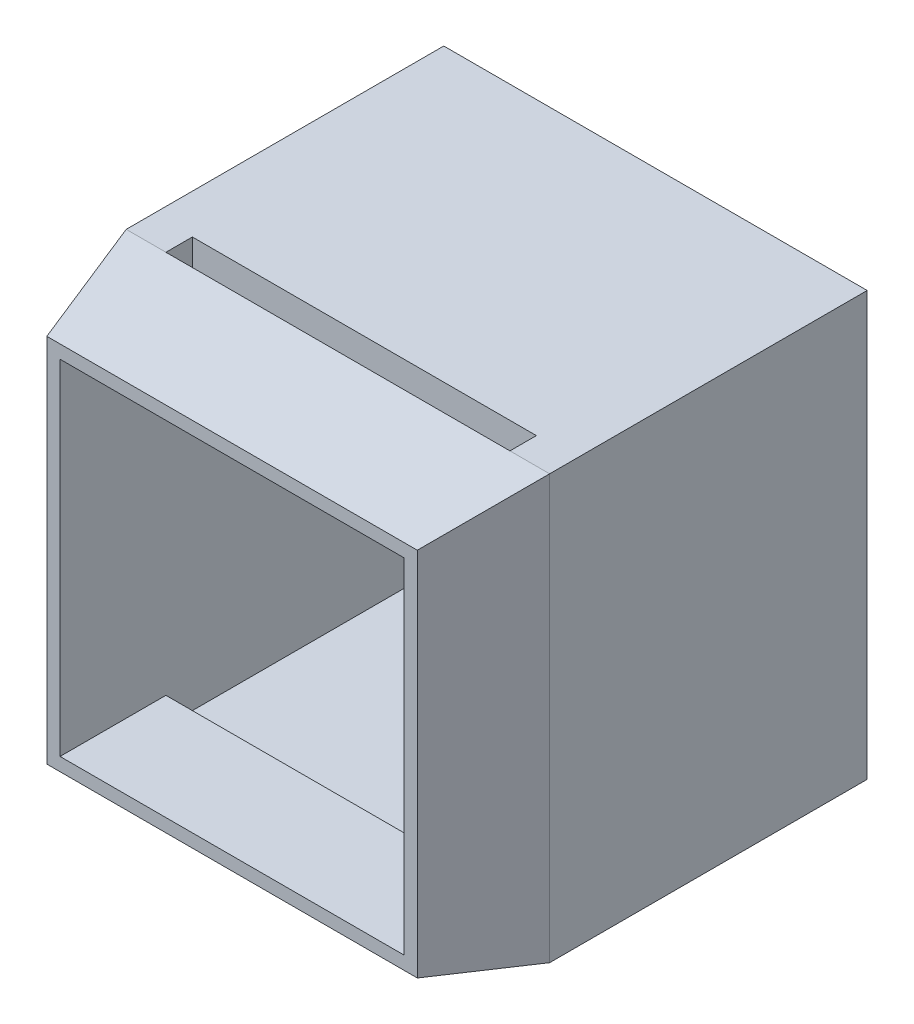
ISO-10303-21;
HEADER;
FILE_DESCRIPTION(('STEP AP214'),'2;1');
FILE_NAME('part.step','',(''),(''),'','','');
FILE_SCHEMA(('AUTOMOTIVE_DESIGN { 1 0 10303 214 1 1 1 1 }'));
ENDSEC;
DATA;
#1=APPLICATION_CONTEXT('core data for automotive mechanical design processes');
#2=APPLICATION_PROTOCOL_DEFINITION('international standard','automotive_design',2000,#1);
#3=PRODUCT_CONTEXT('',#1,'mechanical');
#4=PRODUCT('Part','Part','',(#3));
#5=PRODUCT_RELATED_PRODUCT_CATEGORY('part','',(#4));
#6=PRODUCT_DEFINITION_FORMATION('','',#4);
#7=PRODUCT_DEFINITION_CONTEXT('part definition',#1,'design');
#8=PRODUCT_DEFINITION('design','',#6,#7);
#9=PRODUCT_DEFINITION_SHAPE('','',#8);
#10=(LENGTH_UNIT() NAMED_UNIT(*) SI_UNIT(.MILLI.,.METRE.));
#11=(NAMED_UNIT(*) PLANE_ANGLE_UNIT() SI_UNIT($,.RADIAN.));
#12=(NAMED_UNIT(*) SI_UNIT($,.STERADIAN.) SOLID_ANGLE_UNIT());
#13=UNCERTAINTY_MEASURE_WITH_UNIT(LENGTH_MEASURE(1.E-05),#10,'distance_accuracy_value','');
#14=(GEOMETRIC_REPRESENTATION_CONTEXT(3) GLOBAL_UNCERTAINTY_ASSIGNED_CONTEXT((#13)) GLOBAL_UNIT_ASSIGNED_CONTEXT((#10,
#11,#12)) REPRESENTATION_CONTEXT('',''));
#15=CARTESIAN_POINT('',(0.,0.,0.));
#16=DIRECTION('',(0.,0.,1.));
#17=DIRECTION('',(1.,0.,0.));
#18=AXIS2_PLACEMENT_3D('',#15,#16,#17);
#19=CARTESIAN_POINT('',(38.1,-2.50000000145967E-05,279.4));
#20=DIRECTION('',(0.,0.,-1.));
#21=DIRECTION('',(-1.,0.,0.));
#22=AXIS2_PLACEMENT_3D('',#19,#20,#21);
#23=PLANE('',#22);
#24=DIRECTION('',(1.,0.,0.));
#25=VECTOR('',#24,1.);
#26=CARTESIAN_POINT('',(38.1,12.7,279.4));
#27=LINE('',#26,#25);
#28=CARTESIAN_POINT('',(38.1,12.7,279.4));
#29=VERTEX_POINT('',#28);
#30=CARTESIAN_POINT('',(368.3,12.7,279.4));
#31=VERTEX_POINT('',#30);
#32=EDGE_CURVE('E203',#29,#31,#27,.T.);
#33=ORIENTED_EDGE('',*,*,#32,.F.);
#34=DIRECTION('',(0.,1.,0.));
#35=VECTOR('',#34,1.);
#36=CARTESIAN_POINT('',(38.1,-2.50000000145967E-05,279.4));
#37=LINE('',#36,#35);
#38=CARTESIAN_POINT('',(38.1,0.,279.4));
#39=VERTEX_POINT('',#38);
#40=EDGE_CURVE('E201',#39,#29,#37,.T.);
#41=ORIENTED_EDGE('',*,*,#40,.F.);
#42=DIRECTION('',(-1.,0.,0.));
#43=VECTOR('',#42,1.);
#44=CARTESIAN_POINT('',(0.,0.,279.4));
#45=LINE('',#44,#43);
#46=CARTESIAN_POINT('',(368.3,0.,279.4));
#47=VERTEX_POINT('',#46);
#48=EDGE_CURVE('E261',#47,#39,#45,.T.);
#49=ORIENTED_EDGE('',*,*,#48,.F.);
#50=DIRECTION('',(0.,1.,0.));
#51=VECTOR('',#50,1.);
#52=CARTESIAN_POINT('',(368.3,-2.50000000145967E-05,279.4));
#53=LINE('',#52,#51);
#54=EDGE_CURVE('E220',#47,#31,#53,.T.);
#55=ORIENTED_EDGE('',*,*,#54,.T.);
#56=EDGE_LOOP('',(#33,#41,#49,#55));
#57=FACE_BOUND('',#56,.T.);
#58=ADVANCED_FACE('F56',(#57),#23,.F.);
#59=CARTESIAN_POINT('',(38.1,368.3,0.));
#60=DIRECTION('',(0.,1.,0.));
#61=DIRECTION('',(0.,0.,1.));
#62=AXIS2_PLACEMENT_3D('',#59,#60,#61);
#63=PLANE('',#62);
#64=DIRECTION('',(0.,0.,1.));
#65=VECTOR('',#64,1.);
#66=CARTESIAN_POINT('',(368.3,368.3,0.));
#67=LINE('',#66,#65);
#68=CARTESIAN_POINT('',(368.3,368.3,0.));
#69=VERTEX_POINT('',#68);
#70=CARTESIAN_POINT('',(368.3,368.3,279.4));
#71=VERTEX_POINT('',#70);
#72=EDGE_CURVE('E282',#69,#71,#67,.T.);
#73=ORIENTED_EDGE('',*,*,#72,.T.);
#74=DIRECTION('',(-1.,0.,0.));
#75=VECTOR('',#74,1.);
#76=CARTESIAN_POINT('',(38.1,368.3,279.4));
#77=LINE('',#76,#75);
#78=CARTESIAN_POINT('',(38.1,368.3,279.4));
#79=VERTEX_POINT('',#78);
#80=EDGE_CURVE('E253',#71,#79,#77,.T.);
#81=ORIENTED_EDGE('',*,*,#80,.T.);
#82=DIRECTION('',(0.,0.,1.));
#83=VECTOR('',#82,1.);
#84=CARTESIAN_POINT('',(38.1,368.3,0.));
#85=LINE('',#84,#83);
#86=CARTESIAN_POINT('',(38.1,368.3,0.));
#87=VERTEX_POINT('',#86);
#88=EDGE_CURVE('E277',#87,#79,#85,.T.);
#89=ORIENTED_EDGE('',*,*,#88,.F.);
#90=DIRECTION('',(-1.,0.,0.));
#91=VECTOR('',#90,1.);
#92=CARTESIAN_POINT('',(38.1,368.3,0.));
#93=LINE('',#92,#91);
#94=EDGE_CURVE('E190',#69,#87,#93,.T.);
#95=ORIENTED_EDGE('',*,*,#94,.F.);
#96=EDGE_LOOP('',(#73,#81,#89,#95));
#97=FACE_BOUND('',#96,.T.);
#98=ADVANCED_FACE('F358',(#97),#63,.F.);
#99=CARTESIAN_POINT('',(0.,0.,304.8));
#100=DIRECTION('',(1.,0.,0.));
#101=DIRECTION('',(0.,0.,-1.));
#102=AXIS2_PLACEMENT_3D('',#99,#100,#101);
#103=PLANE('',#102);
#104=DIRECTION('',(0.,-1.,0.));
#105=VECTOR('',#104,1.);
#106=CARTESIAN_POINT('',(0.,0.,0.));
#107=LINE('',#106,#105);
#108=CARTESIAN_POINT('',(0.,406.4,0.));
#109=VERTEX_POINT('',#108);
#110=CARTESIAN_POINT('',(0.,0.,0.));
#111=VERTEX_POINT('',#110);
#112=EDGE_CURVE('E314',#109,#111,#107,.T.);
#113=ORIENTED_EDGE('',*,*,#112,.T.);
#114=DIRECTION('',(0.,0.,-1.));
#115=VECTOR('',#114,1.);
#116=CARTESIAN_POINT('',(0.,0.,304.8));
#117=LINE('',#116,#115);
#118=CARTESIAN_POINT('',(0.,0.,304.8));
#119=VERTEX_POINT('',#118);
#120=EDGE_CURVE('E419',#119,#111,#117,.T.);
#121=ORIENTED_EDGE('',*,*,#120,.F.);
#122=DIRECTION('',(0.,1.,0.));
#123=VECTOR('',#122,1.);
#124=CARTESIAN_POINT('',(0.,0.,304.8));
#125=LINE('',#124,#123);
#126=CARTESIAN_POINT('',(0.,406.4,304.8));
#127=VERTEX_POINT('',#126);
#128=EDGE_CURVE('E428',#127,#119,#125,.F.);
#129=ORIENTED_EDGE('',*,*,#128,.F.);
#130=DIRECTION('',(0.,0.,-1.));
#131=VECTOR('',#130,1.);
#132=CARTESIAN_POINT('',(0.,406.4,304.8));
#133=LINE('',#132,#131);
#134=EDGE_CURVE('E439',#127,#109,#133,.T.);
#135=ORIENTED_EDGE('',*,*,#134,.T.);
#136=EDGE_LOOP('',(#113,#121,#129,#135));
#137=FACE_BOUND('',#136,.T.);
#138=ADVANCED_FACE('F58',(#137),#103,.F.);
#139=CARTESIAN_POINT('',(0.,0.,304.8));
#140=DIRECTION('',(0.,1.,0.));
#141=DIRECTION('',(0.,0.,1.));
#142=AXIS2_PLACEMENT_3D('',#139,#140,#141);
#143=PLANE('',#142);
#144=ORIENTED_EDGE('',*,*,#48,.T.);
#145=DIRECTION('',(0.,0.,1.));
#146=VECTOR('',#145,1.);
#147=CARTESIAN_POINT('',(38.1,0.,304.8));
#148=LINE('',#147,#146);
#149=CARTESIAN_POINT('',(38.1,0.,304.8));
#150=VERTEX_POINT('',#149);
#151=EDGE_CURVE('E195',#39,#150,#148,.T.);
#152=ORIENTED_EDGE('',*,*,#151,.T.);
#153=DIRECTION('',(1.,0.,0.));
#154=VECTOR('',#153,1.);
#155=CARTESIAN_POINT('',(0.,0.,304.8));
#156=LINE('',#155,#154);
#157=EDGE_CURVE('E444',#119,#150,#156,.T.);
#158=ORIENTED_EDGE('',*,*,#157,.F.);
#159=ORIENTED_EDGE('',*,*,#120,.T.);
#160=DIRECTION('',(1.,0.,0.));
#161=VECTOR('',#160,1.);
#162=CARTESIAN_POINT('',(0.,0.,0.));
#163=LINE('',#162,#161);
#164=CARTESIAN_POINT('',(406.4,0.,0.));
#165=VERTEX_POINT('',#164);
#166=EDGE_CURVE('E463',#111,#165,#163,.T.);
#167=ORIENTED_EDGE('',*,*,#166,.T.);
#168=DIRECTION('',(0.,0.,-1.));
#169=VECTOR('',#168,1.);
#170=CARTESIAN_POINT('',(406.4,0.,304.8));
#171=LINE('',#170,#169);
#172=CARTESIAN_POINT('',(406.4,0.,304.8));
#173=VERTEX_POINT('',#172);
#174=EDGE_CURVE('E425',#173,#165,#171,.T.);
#175=ORIENTED_EDGE('',*,*,#174,.F.);
#176=CARTESIAN_POINT('',(368.3,0.,304.8));
#177=VERTEX_POINT('',#176);
#178=EDGE_CURVE('E434',#177,#173,#156,.T.);
#179=ORIENTED_EDGE('',*,*,#178,.F.);
#180=DIRECTION('',(0.,0.,-1.));
#181=VECTOR('',#180,1.);
#182=CARTESIAN_POINT('',(368.3,0.,304.8));
#183=LINE('',#182,#181);
#184=EDGE_CURVE('E249',#177,#47,#183,.T.);
#185=ORIENTED_EDGE('',*,*,#184,.T.);
#186=EDGE_LOOP('',(#144,#152,#158,#159,#167,#175,#179,#185));
#187=FACE_BOUND('',#186,.T.);
#188=ADVANCED_FACE('F350',(#187),#143,.F.);
#189=CARTESIAN_POINT('',(406.4,0.,304.8));
#190=DIRECTION('',(-1.,0.,0.));
#191=DIRECTION('',(0.,0.,1.));
#192=AXIS2_PLACEMENT_3D('',#189,#190,#191);
#193=PLANE('',#192);
#194=DIRECTION('',(0.,1.,0.));
#195=VECTOR('',#194,1.);
#196=CARTESIAN_POINT('',(406.4,0.,0.));
#197=LINE('',#196,#195);
#198=CARTESIAN_POINT('',(406.4,406.4,0.));
#199=VERTEX_POINT('',#198);
#200=EDGE_CURVE('E460',#165,#199,#197,.T.);
#201=ORIENTED_EDGE('',*,*,#200,.T.);
#202=DIRECTION('',(0.,0.,-1.));
#203=VECTOR('',#202,1.);
#204=CARTESIAN_POINT('',(406.4,406.4,304.8));
#205=LINE('',#204,#203);
#206=CARTESIAN_POINT('',(406.4,406.4,304.8));
#207=VERTEX_POINT('',#206);
#208=EDGE_CURVE('E451',#207,#199,#205,.T.);
#209=ORIENTED_EDGE('',*,*,#208,.F.);
#210=DIRECTION('',(0.,1.,0.));
#211=VECTOR('',#210,1.);
#212=CARTESIAN_POINT('',(406.4,0.,304.8));
#213=LINE('',#212,#211);
#214=EDGE_CURVE('E440',#173,#207,#213,.T.);
#215=ORIENTED_EDGE('',*,*,#214,.F.);
#216=ORIENTED_EDGE('',*,*,#174,.T.);
#217=EDGE_LOOP('',(#201,#209,#215,#216));
#218=FACE_BOUND('',#217,.T.);
#219=ADVANCED_FACE('F347',(#218),#193,.F.);
#220=CARTESIAN_POINT('',(0.,406.4,304.8));
#221=DIRECTION('',(0.,-1.,0.));
#222=DIRECTION('',(0.,0.,-1.));
#223=AXIS2_PLACEMENT_3D('',#220,#221,#222);
#224=PLANE('',#223);
#225=DIRECTION('',(1.,0.,0.));
#226=VECTOR('',#225,1.);
#227=CARTESIAN_POINT('',(0.,406.4,304.8));
#228=LINE('',#227,#226);
#229=CARTESIAN_POINT('',(38.1,406.4,304.8));
#230=VERTEX_POINT('',#229);
#231=EDGE_CURVE('E389',#230,#127,#228,.F.);
#232=ORIENTED_EDGE('',*,*,#231,.F.);
#233=DIRECTION('',(0.,0.,-1.));
#234=VECTOR('',#233,1.);
#235=CARTESIAN_POINT('',(38.1,406.4,304.8));
#236=LINE('',#235,#234);
#237=CARTESIAN_POINT('',(38.1,406.4,279.4));
#238=VERTEX_POINT('',#237);
#239=EDGE_CURVE('E265',#230,#238,#236,.T.);
#240=ORIENTED_EDGE('',*,*,#239,.T.);
#241=DIRECTION('',(1.,0.,0.));
#242=VECTOR('',#241,1.);
#243=CARTESIAN_POINT('',(0.,406.4,279.4));
#244=LINE('',#243,#242);
#245=CARTESIAN_POINT('',(368.3,406.4,279.4));
#246=VERTEX_POINT('',#245);
#247=EDGE_CURVE('E257',#238,#246,#244,.T.);
#248=ORIENTED_EDGE('',*,*,#247,.T.);
#249=DIRECTION('',(0.,0.,1.));
#250=VECTOR('',#249,1.);
#251=CARTESIAN_POINT('',(368.3,406.4,304.8));
#252=LINE('',#251,#250);
#253=CARTESIAN_POINT('',(368.3,406.4,304.8));
#254=VERTEX_POINT('',#253);
#255=EDGE_CURVE('E245',#246,#254,#252,.T.);
#256=ORIENTED_EDGE('',*,*,#255,.T.);
#257=EDGE_CURVE('E436',#207,#254,#228,.F.);
#258=ORIENTED_EDGE('',*,*,#257,.F.);
#259=ORIENTED_EDGE('',*,*,#208,.T.);
#260=DIRECTION('',(-1.,0.,0.));
#261=VECTOR('',#260,1.);
#262=CARTESIAN_POINT('',(0.,406.4,0.));
#263=LINE('',#262,#261);
#264=EDGE_CURVE('E435',#199,#109,#263,.T.);
#265=ORIENTED_EDGE('',*,*,#264,.T.);
#266=ORIENTED_EDGE('',*,*,#134,.F.);
#267=EDGE_LOOP('',(#232,#240,#248,#256,#258,#259,#265,#266));
#268=FACE_BOUND('',#267,.T.);
#269=ADVANCED_FACE('F344',(#268),#224,.F.);
#270=CARTESIAN_POINT('',(0.,0.,0.));
#271=DIRECTION('',(0.,0.,-1.));
#272=DIRECTION('',(-1.,0.,0.));
#273=AXIS2_PLACEMENT_3D('',#270,#271,#272);
#274=PLANE('',#273);
#275=DIRECTION('',(-1.,0.,0.));
#276=VECTOR('',#275,1.);
#277=CARTESIAN_POINT('',(368.3,12.7,0.));
#278=LINE('',#277,#276);
#279=CARTESIAN_POINT('',(368.3,12.7,0.));
#280=VERTEX_POINT('',#279);
#281=CARTESIAN_POINT('',(38.1,12.7,0.));
#282=VERTEX_POINT('',#281);
#283=EDGE_CURVE('E188',#280,#282,#278,.T.);
#284=ORIENTED_EDGE('',*,*,#283,.F.);
#285=DIRECTION('',(0.,1.,0.));
#286=VECTOR('',#285,1.);
#287=CARTESIAN_POINT('',(368.3,38.1,0.));
#288=LINE('',#287,#286);
#289=EDGE_CURVE('E194',#280,#69,#288,.T.);
#290=ORIENTED_EDGE('',*,*,#289,.T.);
#291=ORIENTED_EDGE('',*,*,#94,.T.);
#292=DIRECTION('',(0.,-1.,0.));
#293=VECTOR('',#292,1.);
#294=CARTESIAN_POINT('',(38.1,38.1,0.));
#295=LINE('',#294,#293);
#296=EDGE_CURVE('E184',#87,#282,#295,.T.);
#297=ORIENTED_EDGE('',*,*,#296,.T.);
#298=EDGE_LOOP('',(#284,#290,#291,#297));
#299=FACE_BOUND('',#298,.T.);
#300=ORIENTED_EDGE('',*,*,#112,.F.);
#301=ORIENTED_EDGE('',*,*,#264,.F.);
#302=ORIENTED_EDGE('',*,*,#200,.F.);
#303=ORIENTED_EDGE('',*,*,#166,.F.);
#304=EDGE_LOOP('',(#300,#301,#302,#303));
#305=FACE_BOUND('',#304,.T.);
#306=ADVANCED_FACE('F185',(#299,#305),#274,.T.);
#307=CARTESIAN_POINT('',(0.,0.,406.4));
#308=DIRECTION('',(0.,0.,-1.));
#309=DIRECTION('',(-1.,0.,0.));
#310=AXIS2_PLACEMENT_3D('',#307,#308,#309);
#311=PLANE('',#310);
#312=DIRECTION('',(-1.,0.,0.));
#313=VECTOR('',#312,1.);
#314=CARTESIAN_POINT('',(0.,38.1,406.4));
#315=LINE('',#314,#313);
#316=CARTESIAN_POINT('',(368.3,38.1,406.4));
#317=VERTEX_POINT('',#316);
#318=CARTESIAN_POINT('',(38.1,38.1,406.4));
#319=VERTEX_POINT('',#318);
#320=EDGE_CURVE('E414',#317,#319,#315,.T.);
#321=ORIENTED_EDGE('',*,*,#320,.T.);
#322=DIRECTION('',(0.,1.,0.));
#323=VECTOR('',#322,1.);
#324=CARTESIAN_POINT('',(38.1,0.,406.4));
#325=LINE('',#324,#323);
#326=CARTESIAN_POINT('',(38.1,368.3,406.4));
#327=VERTEX_POINT('',#326);
#328=EDGE_CURVE('E65',#319,#327,#325,.T.);
#329=ORIENTED_EDGE('',*,*,#328,.T.);
#330=DIRECTION('',(1.,0.,0.));
#331=VECTOR('',#330,1.);
#332=CARTESIAN_POINT('',(0.,368.3,406.4));
#333=LINE('',#332,#331);
#334=CARTESIAN_POINT('',(368.3,368.3,406.4));
#335=VERTEX_POINT('',#334);
#336=EDGE_CURVE('E395',#327,#335,#333,.T.);
#337=ORIENTED_EDGE('',*,*,#336,.T.);
#338=DIRECTION('',(0.,-1.,0.));
#339=VECTOR('',#338,1.);
#340=CARTESIAN_POINT('',(368.3,0.,406.4));
#341=LINE('',#340,#339);
#342=EDGE_CURVE('E417',#335,#317,#341,.T.);
#343=ORIENTED_EDGE('',*,*,#342,.T.);
#344=EDGE_LOOP('',(#321,#329,#337,#343));
#345=FACE_BOUND('',#344,.T.);
#346=DIRECTION('',(0.,-1.,0.));
#347=VECTOR('',#346,1.);
#348=CARTESIAN_POINT('',(25.4,25.4,406.4));
#349=LINE('',#348,#347);
#350=CARTESIAN_POINT('',(25.4,381.,406.4));
#351=VERTEX_POINT('',#350);
#352=CARTESIAN_POINT('',(25.4,25.4,406.4));
#353=VERTEX_POINT('',#352);
#354=EDGE_CURVE('E280',#351,#353,#349,.T.);
#355=ORIENTED_EDGE('',*,*,#354,.T.);
#356=DIRECTION('',(1.,0.,0.));
#357=VECTOR('',#356,1.);
#358=CARTESIAN_POINT('',(25.4,25.4,406.4));
#359=LINE('',#358,#357);
#360=CARTESIAN_POINT('',(381.,25.4,406.4));
#361=VERTEX_POINT('',#360);
#362=EDGE_CURVE('E303',#353,#361,#359,.T.);
#363=ORIENTED_EDGE('',*,*,#362,.T.);
#364=DIRECTION('',(0.,1.,0.));
#365=VECTOR('',#364,1.);
#366=CARTESIAN_POINT('',(381.,25.4,406.4));
#367=LINE('',#366,#365);
#368=CARTESIAN_POINT('',(381.,381.,406.4));
#369=VERTEX_POINT('',#368);
#370=EDGE_CURVE('E511',#361,#369,#367,.T.);
#371=ORIENTED_EDGE('',*,*,#370,.T.);
#372=DIRECTION('',(-1.,0.,0.));
#373=VECTOR('',#372,1.);
#374=CARTESIAN_POINT('',(25.4,381.,406.4));
#375=LINE('',#374,#373);
#376=EDGE_CURVE('E504',#369,#351,#375,.T.);
#377=ORIENTED_EDGE('',*,*,#376,.T.);
#378=EDGE_LOOP('',(#355,#363,#371,#377));
#379=FACE_BOUND('',#378,.T.);
#380=ADVANCED_FACE('F343',(#345,#379),#311,.F.);
#381=CARTESIAN_POINT('',(0.,454.211764705882,113.552941176471));
#382=DIRECTION('',(0.,-0.970142500145332,-0.242535625036333));
#383=DIRECTION('',(0.,0.242535625036333,-0.970142500145332));
#384=AXIS2_PLACEMENT_3D('',#381,#382,#383);
#385=PLANE('',#384);
#386=DIRECTION('',(0.235702260395516,-0.235702260395516,0.942809041582063));
#387=VECTOR('',#386,1.);
#388=CARTESIAN_POINT('',(0.,406.4,304.8));
#389=LINE('',#388,#387);
#390=EDGE_CURVE('E297',#127,#351,#389,.T.);
#391=ORIENTED_EDGE('',*,*,#390,.T.);
#392=ORIENTED_EDGE('',*,*,#376,.F.);
#393=DIRECTION('',(-0.235702260395516,-0.235702260395516,0.942809041582063));
#394=VECTOR('',#393,1.);
#395=CARTESIAN_POINT('',(406.4,406.4,304.8));
#396=LINE('',#395,#394);
#397=EDGE_CURVE('E292',#207,#369,#396,.T.);
#398=ORIENTED_EDGE('',*,*,#397,.F.);
#399=ORIENTED_EDGE('',*,*,#257,.T.);
#400=DIRECTION('',(-1.,0.,0.));
#401=VECTOR('',#400,1.);
#402=CARTESIAN_POINT('',(0.,406.4,304.8));
#403=LINE('',#402,#401);
#404=EDGE_CURVE('E241',#254,#230,#403,.T.);
#405=ORIENTED_EDGE('',*,*,#404,.T.);
#406=ORIENTED_EDGE('',*,*,#231,.T.);
#407=EDGE_LOOP('',(#391,#392,#398,#399,#405,#406));
#408=FACE_BOUND('',#407,.T.);
#409=ADVANCED_FACE('F483',(#408),#385,.F.);
#410=CARTESIAN_POINT('',(454.211764705882,0.,113.552941176471));
#411=DIRECTION('',(-0.970142500145332,0.,-0.242535625036333));
#412=DIRECTION('',(-0.242535625036333,0.,0.970142500145332));
#413=AXIS2_PLACEMENT_3D('',#410,#411,#412);
#414=PLANE('',#413);
#415=ORIENTED_EDGE('',*,*,#397,.T.);
#416=ORIENTED_EDGE('',*,*,#370,.F.);
#417=DIRECTION('',(-0.235702260395516,0.235702260395516,0.942809041582063));
#418=VECTOR('',#417,1.);
#419=CARTESIAN_POINT('',(406.4,0.,304.8));
#420=LINE('',#419,#418);
#421=EDGE_CURVE('E308',#173,#361,#420,.T.);
#422=ORIENTED_EDGE('',*,*,#421,.F.);
#423=ORIENTED_EDGE('',*,*,#214,.T.);
#424=EDGE_LOOP('',(#415,#416,#422,#423));
#425=FACE_BOUND('',#424,.T.);
#426=ADVANCED_FACE('F530',(#425),#414,.F.);
#427=CARTESIAN_POINT('',(-71.7176470588236,0.,17.9294117647059));
#428=DIRECTION('',(0.970142500145332,0.,-0.242535625036333));
#429=DIRECTION('',(-0.242535625036333,0.,-0.970142500145332));
#430=AXIS2_PLACEMENT_3D('',#427,#428,#429);
#431=PLANE('',#430);
#432=DIRECTION('',(0.235702260395516,0.235702260395516,0.942809041582063));
#433=VECTOR('',#432,1.);
#434=CARTESIAN_POINT('',(0.,0.,304.8));
#435=LINE('',#434,#433);
#436=EDGE_CURVE('E296',#119,#353,#435,.T.);
#437=ORIENTED_EDGE('',*,*,#436,.T.);
#438=ORIENTED_EDGE('',*,*,#354,.F.);
#439=ORIENTED_EDGE('',*,*,#390,.F.);
#440=ORIENTED_EDGE('',*,*,#128,.T.);
#441=EDGE_LOOP('',(#437,#438,#439,#440));
#442=FACE_BOUND('',#441,.T.);
#443=ADVANCED_FACE('F338',(#442),#431,.F.);
#444=CARTESIAN_POINT('',(0.,-71.7176470588236,17.9294117647059));
#445=DIRECTION('',(0.,0.970142500145332,-0.242535625036333));
#446=DIRECTION('',(0.,0.242535625036333,0.970142500145332));
#447=AXIS2_PLACEMENT_3D('',#444,#445,#446);
#448=PLANE('',#447);
#449=ORIENTED_EDGE('',*,*,#421,.T.);
#450=ORIENTED_EDGE('',*,*,#362,.F.);
#451=ORIENTED_EDGE('',*,*,#436,.F.);
#452=ORIENTED_EDGE('',*,*,#157,.T.);
#453=DIRECTION('',(1.,0.,0.));
#454=VECTOR('',#453,1.);
#455=CARTESIAN_POINT('',(0.,0.,304.8));
#456=LINE('',#455,#454);
#457=EDGE_CURVE('E237',#150,#177,#456,.T.);
#458=ORIENTED_EDGE('',*,*,#457,.T.);
#459=ORIENTED_EDGE('',*,*,#178,.T.);
#460=EDGE_LOOP('',(#449,#450,#451,#452,#458,#459));
#461=FACE_BOUND('',#460,.T.);
#462=ADVANCED_FACE('F328',(#461),#448,.F.);
#463=CARTESIAN_POINT('',(38.1,38.1,0.));
#464=DIRECTION('',(-1.,0.,0.));
#465=DIRECTION('',(0.,0.,1.));
#466=AXIS2_PLACEMENT_3D('',#463,#464,#465);
#467=PLANE('',#466);
#468=DIRECTION('',(0.,0.,1.));
#469=VECTOR('',#468,1.);
#470=CARTESIAN_POINT('',(38.1,38.1,0.));
#471=LINE('',#470,#469);
#472=CARTESIAN_POINT('',(38.1,38.1,304.8));
#473=VERTEX_POINT('',#472);
#474=EDGE_CURVE('E276',#473,#319,#471,.T.);
#475=ORIENTED_EDGE('',*,*,#474,.F.);
#476=DIRECTION('',(0.,1.,0.));
#477=VECTOR('',#476,1.);
#478=CARTESIAN_POINT('',(38.1,-2.50000000145967E-05,304.8));
#479=LINE('',#478,#477);
#480=EDGE_CURVE('E230',#150,#473,#479,.T.);
#481=ORIENTED_EDGE('',*,*,#480,.F.);
#482=ORIENTED_EDGE('',*,*,#151,.F.);
#483=ORIENTED_EDGE('',*,*,#40,.T.);
#484=DIRECTION('',(0.,0.,1.));
#485=VECTOR('',#484,1.);
#486=CARTESIAN_POINT('',(38.1,12.7,0.));
#487=LINE('',#486,#485);
#488=EDGE_CURVE('E72',#282,#29,#487,.T.);
#489=ORIENTED_EDGE('',*,*,#488,.F.);
#490=ORIENTED_EDGE('',*,*,#296,.F.);
#491=ORIENTED_EDGE('',*,*,#88,.T.);
#492=EDGE_CURVE('E216',#79,#238,#37,.T.);
#493=ORIENTED_EDGE('',*,*,#492,.T.);
#494=ORIENTED_EDGE('',*,*,#239,.F.);
#495=CARTESIAN_POINT('',(38.1,368.3,304.8));
#496=VERTEX_POINT('',#495);
#497=EDGE_CURVE('E80',#496,#230,#479,.T.);
#498=ORIENTED_EDGE('',*,*,#497,.F.);
#499=EDGE_CURVE('E281',#496,#327,#85,.T.);
#500=ORIENTED_EDGE('',*,*,#499,.T.);
#501=ORIENTED_EDGE('',*,*,#328,.F.);
#502=EDGE_LOOP('',(#475,#481,#482,#483,#489,#490,#491,#493,#494,#498,#500,#501));
#503=FACE_BOUND('',#502,.T.);
#504=ADVANCED_FACE('F199',(#503),#467,.F.);
#505=ORIENTED_EDGE('',*,*,#499,.F.);
#506=DIRECTION('',(1.,0.,0.));
#507=VECTOR('',#506,1.);
#508=CARTESIAN_POINT('',(38.1,368.3,304.8));
#509=LINE('',#508,#507);
#510=CARTESIAN_POINT('',(368.3,368.3,304.8));
#511=VERTEX_POINT('',#510);
#512=EDGE_CURVE('E233',#496,#511,#509,.T.);
#513=ORIENTED_EDGE('',*,*,#512,.T.);
#514=EDGE_CURVE('E286',#511,#335,#67,.T.);
#515=ORIENTED_EDGE('',*,*,#514,.T.);
#516=ORIENTED_EDGE('',*,*,#336,.F.);
#517=EDGE_LOOP('',(#505,#513,#515,#516));
#518=FACE_BOUND('',#517,.T.);
#519=ADVANCED_FACE('F369',(#518),#63,.F.);
#520=CARTESIAN_POINT('',(368.3,38.1,0.));
#521=DIRECTION('',(1.,0.,0.));
#522=DIRECTION('',(0.,0.,-1.));
#523=AXIS2_PLACEMENT_3D('',#520,#521,#522);
#524=PLANE('',#523);
#525=ORIENTED_EDGE('',*,*,#514,.F.);
#526=DIRECTION('',(0.,1.,0.));
#527=VECTOR('',#526,1.);
#528=CARTESIAN_POINT('',(368.3,-2.50000000145967E-05,304.8));
#529=LINE('',#528,#527);
#530=EDGE_CURVE('E226',#511,#254,#529,.T.);
#531=ORIENTED_EDGE('',*,*,#530,.T.);
#532=ORIENTED_EDGE('',*,*,#255,.F.);
#533=EDGE_CURVE('E221',#71,#246,#53,.T.);
#534=ORIENTED_EDGE('',*,*,#533,.F.);
#535=ORIENTED_EDGE('',*,*,#72,.F.);
#536=ORIENTED_EDGE('',*,*,#289,.F.);
#537=DIRECTION('',(0.,0.,-1.));
#538=VECTOR('',#537,1.);
#539=CARTESIAN_POINT('',(368.3,12.7,279.4));
#540=LINE('',#539,#538);
#541=EDGE_CURVE('E208',#31,#280,#540,.T.);
#542=ORIENTED_EDGE('',*,*,#541,.F.);
#543=ORIENTED_EDGE('',*,*,#54,.F.);
#544=ORIENTED_EDGE('',*,*,#184,.F.);
#545=CARTESIAN_POINT('',(368.3,38.1,304.8));
#546=VERTEX_POINT('',#545);
#547=EDGE_CURVE('E225',#177,#546,#529,.T.);
#548=ORIENTED_EDGE('',*,*,#547,.T.);
#549=DIRECTION('',(0.,0.,1.));
#550=VECTOR('',#549,1.);
#551=CARTESIAN_POINT('',(368.3,38.1,0.));
#552=LINE('',#551,#550);
#553=EDGE_CURVE('E287',#546,#317,#552,.T.);
#554=ORIENTED_EDGE('',*,*,#553,.T.);
#555=ORIENTED_EDGE('',*,*,#342,.F.);
#556=EDGE_LOOP('',(#525,#531,#532,#534,#535,#536,#542,#543,#544,#548,#554,#555));
#557=FACE_BOUND('',#556,.T.);
#558=ADVANCED_FACE('F384',(#557),#524,.F.);
#559=CARTESIAN_POINT('',(38.1,38.1,0.));
#560=DIRECTION('',(0.,-1.,0.));
#561=DIRECTION('',(0.,0.,-1.));
#562=AXIS2_PLACEMENT_3D('',#559,#560,#561);
#563=PLANE('',#562);
#564=ORIENTED_EDGE('',*,*,#553,.F.);
#565=DIRECTION('',(-1.,0.,0.));
#566=VECTOR('',#565,1.);
#567=CARTESIAN_POINT('',(38.1,38.1,304.8));
#568=LINE('',#567,#566);
#569=EDGE_CURVE('E12',#546,#473,#568,.T.);
#570=ORIENTED_EDGE('',*,*,#569,.T.);
#571=ORIENTED_EDGE('',*,*,#474,.T.);
#572=ORIENTED_EDGE('',*,*,#320,.F.);
#573=EDGE_LOOP('',(#564,#570,#571,#572));
#574=FACE_BOUND('',#573,.T.);
#575=ADVANCED_FACE('F379',(#574),#563,.F.);
#576=CARTESIAN_POINT('',(38.1,-2.50000000145967E-05,304.8));
#577=DIRECTION('',(0.,0.,1.));
#578=DIRECTION('',(1.,0.,0.));
#579=AXIS2_PLACEMENT_3D('',#576,#577,#578);
#580=PLANE('',#579);
#581=ORIENTED_EDGE('',*,*,#480,.T.);
#582=ORIENTED_EDGE('',*,*,#569,.F.);
#583=ORIENTED_EDGE('',*,*,#547,.F.);
#584=ORIENTED_EDGE('',*,*,#457,.F.);
#585=EDGE_LOOP('',(#581,#582,#583,#584));
#586=FACE_BOUND('',#585,.T.);
#587=ADVANCED_FACE('F374',(#586),#580,.F.);
#588=ORIENTED_EDGE('',*,*,#492,.F.);
#589=ORIENTED_EDGE('',*,*,#80,.F.);
#590=ORIENTED_EDGE('',*,*,#533,.T.);
#591=ORIENTED_EDGE('',*,*,#247,.F.);
#592=EDGE_LOOP('',(#588,#589,#590,#591));
#593=FACE_BOUND('',#592,.T.);
#594=ADVANCED_FACE('F363',(#593),#23,.F.);
#595=ORIENTED_EDGE('',*,*,#530,.F.);
#596=ORIENTED_EDGE('',*,*,#512,.F.);
#597=ORIENTED_EDGE('',*,*,#497,.T.);
#598=ORIENTED_EDGE('',*,*,#404,.F.);
#599=EDGE_LOOP('',(#595,#596,#597,#598));
#600=FACE_BOUND('',#599,.T.);
#601=ADVANCED_FACE('F373',(#600),#580,.F.);
#602=CARTESIAN_POINT('',(0.,12.7,0.));
#603=DIRECTION('',(0.,1.,0.));
#604=DIRECTION('',(0.,0.,1.));
#605=AXIS2_PLACEMENT_3D('',#602,#603,#604);
#606=PLANE('',#605);
#607=ORIENTED_EDGE('',*,*,#283,.T.);
#608=ORIENTED_EDGE('',*,*,#488,.T.);
#609=ORIENTED_EDGE('',*,*,#32,.T.);
#610=ORIENTED_EDGE('',*,*,#541,.T.);
#611=EDGE_LOOP('',(#607,#608,#609,#610));
#612=FACE_BOUND('',#611,.T.);
#613=ADVANCED_FACE('F206',(#612),#606,.T.);
#614=CLOSED_SHELL('',(#58,#98,#138,#188,#219,#269,#306,#380,#409,#426,#443,#462,#504,#519,#558,
#575,#587,#594,#601,#613));
#615=MANIFOLD_SOLID_BREP('B2',#614);
#616=ADVANCED_BREP_SHAPE_REPRESENTATION('',(#18,#615),#14);
#617=SHAPE_DEFINITION_REPRESENTATION(#9,#616);
ENDSEC;
END-ISO-10303-21;
